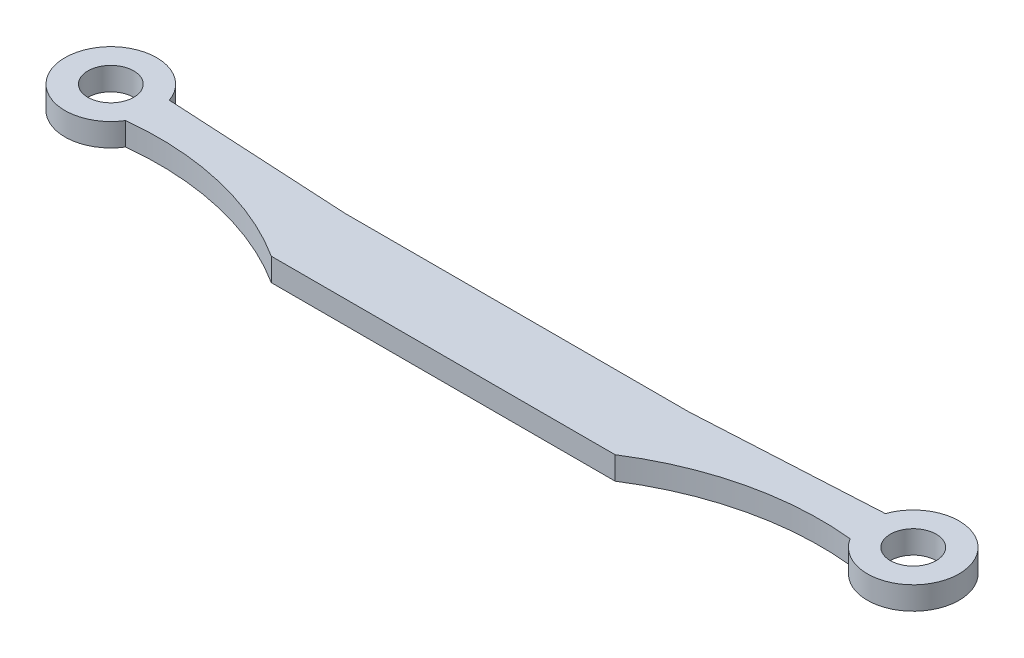
ISO-10303-21;
HEADER;
FILE_DESCRIPTION(('STEP AP214'),'2;1');
FILE_NAME('part.step','',(''),(''),'','','');
FILE_SCHEMA(('AUTOMOTIVE_DESIGN { 1 0 10303 214 1 1 1 1 }'));
ENDSEC;
DATA;
#1=APPLICATION_CONTEXT('core data for automotive mechanical design processes');
#2=APPLICATION_PROTOCOL_DEFINITION('international standard','automotive_design',2000,#1);
#3=PRODUCT_CONTEXT('',#1,'mechanical');
#4=PRODUCT('Part','Part','',(#3));
#5=PRODUCT_RELATED_PRODUCT_CATEGORY('part','',(#4));
#6=PRODUCT_DEFINITION_FORMATION('','',#4);
#7=PRODUCT_DEFINITION_CONTEXT('part definition',#1,'design');
#8=PRODUCT_DEFINITION('design','',#6,#7);
#9=PRODUCT_DEFINITION_SHAPE('','',#8);
#10=(LENGTH_UNIT() NAMED_UNIT(*) SI_UNIT(.MILLI.,.METRE.));
#11=(NAMED_UNIT(*) PLANE_ANGLE_UNIT() SI_UNIT($,.RADIAN.));
#12=(NAMED_UNIT(*) SI_UNIT($,.STERADIAN.) SOLID_ANGLE_UNIT());
#13=UNCERTAINTY_MEASURE_WITH_UNIT(LENGTH_MEASURE(1.E-05),#10,'distance_accuracy_value','');
#14=(GEOMETRIC_REPRESENTATION_CONTEXT(3) GLOBAL_UNCERTAINTY_ASSIGNED_CONTEXT((#13)) GLOBAL_UNIT_ASSIGNED_CONTEXT((#10,
#11,#12)) REPRESENTATION_CONTEXT('',''));
#15=CARTESIAN_POINT('',(0.,0.,0.));
#16=DIRECTION('',(0.,0.,1.));
#17=DIRECTION('',(1.,0.,0.));
#18=AXIS2_PLACEMENT_3D('',#15,#16,#17);
#19=CARTESIAN_POINT('',(0.,2.,10.));
#20=DIRECTION('',(0.,0.,-1.));
#21=DIRECTION('',(-1.,0.,0.));
#22=AXIS2_PLACEMENT_3D('',#19,#20,#21);
#23=PLANE('',#22);
#24=DIRECTION('',(1.,0.,0.));
#25=VECTOR('',#24,1.);
#26=CARTESIAN_POINT('',(0.,2.,10.));
#27=LINE('',#26,#25);
#28=CARTESIAN_POINT('',(-19.99,2.,10.));
#29=VERTEX_POINT('',#28);
#30=CARTESIAN_POINT('',(10.,2.,10.));
#31=VERTEX_POINT('',#30);
#32=EDGE_CURVE('E87',#29,#31,#27,.T.);
#33=ORIENTED_EDGE('',*,*,#32,.F.);
#34=DIRECTION('',(0.,-1.,0.));
#35=VECTOR('',#34,1.);
#36=CARTESIAN_POINT('',(-19.99,2.,10.));
#37=LINE('',#36,#35);
#38=CARTESIAN_POINT('',(-19.99,0.,10.));
#39=VERTEX_POINT('',#38);
#40=EDGE_CURVE('E113',#29,#39,#37,.T.);
#41=ORIENTED_EDGE('',*,*,#40,.T.);
#42=DIRECTION('',(1.,0.,0.));
#43=VECTOR('',#42,1.);
#44=CARTESIAN_POINT('',(0.,0.,10.));
#45=LINE('',#44,#43);
#46=CARTESIAN_POINT('',(10.,0.,10.));
#47=VERTEX_POINT('',#46);
#48=EDGE_CURVE('E133',#39,#47,#45,.T.);
#49=ORIENTED_EDGE('',*,*,#48,.T.);
#50=DIRECTION('',(0.,-1.,0.));
#51=VECTOR('',#50,1.);
#52=CARTESIAN_POINT('',(10.,2.,10.));
#53=LINE('',#52,#51);
#54=EDGE_CURVE('E11',#31,#47,#53,.T.);
#55=ORIENTED_EDGE('',*,*,#54,.F.);
#56=EDGE_LOOP('',(#33,#41,#49,#55));
#57=FACE_BOUND('',#56,.T.);
#58=ADVANCED_FACE('F40',(#57),#23,.F.);
#59=CARTESIAN_POINT('',(23.8689213397825,2.,31.7666757771545));
#60=DIRECTION('',(0.,-1.,0.));
#61=DIRECTION('',(0.,0.,-1.));
#62=AXIS2_PLACEMENT_3D('',#59,#60,#61);
#63=CYLINDRICAL_SURFACE('',#62,25.809594214494);
#64=CARTESIAN_POINT('',(23.8689213397825,0.,31.7666757771545));
#65=DIRECTION('',(0.,1.,0.));
#66=DIRECTION('',(0.,0.,1.));
#67=AXIS2_PLACEMENT_3D('',#64,#65,#66);
#68=CIRCLE('',#67,25.809594214494);
#69=CARTESIAN_POINT('',(26.5965924102481,0.,6.10162241566342));
#70=VERTEX_POINT('',#69);
#71=EDGE_CURVE('E136',#47,#70,#68,.F.);
#72=ORIENTED_EDGE('',*,*,#71,.T.);
#73=DIRECTION('',(0.,-1.,0.));
#74=VECTOR('',#73,1.);
#75=CARTESIAN_POINT('',(26.5965924102481,2.,6.10162241566342));
#76=LINE('',#75,#74);
#77=CARTESIAN_POINT('',(26.5965924102481,2.,6.10162241566342));
#78=VERTEX_POINT('',#77);
#79=EDGE_CURVE('E48',#78,#70,#76,.T.);
#80=ORIENTED_EDGE('',*,*,#79,.F.);
#81=CARTESIAN_POINT('',(23.8689213397825,2.,31.7666757771545));
#82=DIRECTION('',(0.,1.,0.));
#83=DIRECTION('',(0.,0.,1.));
#84=AXIS2_PLACEMENT_3D('',#81,#82,#83);
#85=CIRCLE('',#84,25.809594214494);
#86=EDGE_CURVE('E115',#31,#78,#85,.F.);
#87=ORIENTED_EDGE('',*,*,#86,.F.);
#88=ORIENTED_EDGE('',*,*,#54,.T.);
#89=EDGE_LOOP('',(#72,#80,#87,#88));
#90=FACE_BOUND('',#89,.T.);
#91=ADVANCED_FACE('F199',(#90),#63,.F.);
#92=CARTESIAN_POINT('',(30.,2.,4.));
#93=DIRECTION('',(0.,-1.,0.));
#94=DIRECTION('',(0.,0.,-1.));
#95=AXIS2_PLACEMENT_3D('',#92,#93,#94);
#96=CYLINDRICAL_SURFACE('',#95,4.);
#97=CARTESIAN_POINT('',(30.,0.,4.));
#98=DIRECTION('',(0.,1.,0.));
#99=DIRECTION('',(0.,0.,1.));
#100=AXIS2_PLACEMENT_3D('',#97,#98,#99);
#101=CIRCLE('',#100,4.);
#102=CARTESIAN_POINT('',(26.229666851978,0.,2.66411529205295));
#103=VERTEX_POINT('',#102);
#104=EDGE_CURVE('E74',#70,#103,#101,.T.);
#105=ORIENTED_EDGE('',*,*,#104,.T.);
#106=DIRECTION('',(0.,-1.,0.));
#107=VECTOR('',#106,1.);
#108=CARTESIAN_POINT('',(26.229666851978,2.,2.66411529205295));
#109=LINE('',#108,#107);
#110=CARTESIAN_POINT('',(26.229666851978,2.,2.66411529205295));
#111=VERTEX_POINT('',#110);
#112=EDGE_CURVE('E160',#111,#103,#109,.T.);
#113=ORIENTED_EDGE('',*,*,#112,.F.);
#114=CARTESIAN_POINT('',(30.,2.,4.));
#115=DIRECTION('',(0.,1.,0.));
#116=DIRECTION('',(0.,0.,1.));
#117=AXIS2_PLACEMENT_3D('',#114,#115,#116);
#118=CIRCLE('',#117,4.);
#119=EDGE_CURVE('E143',#78,#111,#118,.T.);
#120=ORIENTED_EDGE('',*,*,#119,.F.);
#121=ORIENTED_EDGE('',*,*,#79,.T.);
#122=EDGE_LOOP('',(#105,#113,#120,#121));
#123=FACE_BOUND('',#122,.T.);
#124=ADVANCED_FACE('F163',(#123),#96,.T.);
#125=CARTESIAN_POINT('',(0.22258922452665,2.,4.08219815400718));
#126=DIRECTION('',(0.0544459269489316,0.,0.998516720460239));
#127=DIRECTION('',(0.998516720460239,0.,-0.0544459269489316));
#128=AXIS2_PLACEMENT_3D('',#125,#126,#127);
#129=PLANE('',#128);
#130=DIRECTION('',(-0.998516720460239,0.,0.0544459269489316));
#131=VECTOR('',#130,1.);
#132=CARTESIAN_POINT('',(0.22258922452665,0.,4.08219815400718));
#133=LINE('',#132,#131);
#134=CARTESIAN_POINT('',(10.,0.,3.54906717890869));
#135=VERTEX_POINT('',#134);
#136=EDGE_CURVE('E80',#103,#135,#133,.T.);
#137=ORIENTED_EDGE('',*,*,#136,.T.);
#138=DIRECTION('',(0.,-1.,0.));
#139=VECTOR('',#138,1.);
#140=CARTESIAN_POINT('',(10.,2.,3.54906717890869));
#141=LINE('',#140,#139);
#142=CARTESIAN_POINT('',(10.,2.,3.54906717890869));
#143=VERTEX_POINT('',#142);
#144=EDGE_CURVE('E150',#143,#135,#141,.T.);
#145=ORIENTED_EDGE('',*,*,#144,.F.);
#146=DIRECTION('',(-0.998516720460239,0.,0.0544459269489316));
#147=VECTOR('',#146,1.);
#148=CARTESIAN_POINT('',(0.22258922452665,2.,4.08219815400718));
#149=LINE('',#148,#147);
#150=EDGE_CURVE('E56',#111,#143,#149,.T.);
#151=ORIENTED_EDGE('',*,*,#150,.F.);
#152=ORIENTED_EDGE('',*,*,#112,.T.);
#153=EDGE_LOOP('',(#137,#145,#151,#152));
#154=FACE_BOUND('',#153,.T.);
#155=ADVANCED_FACE('F200',(#154),#129,.F.);
#156=CARTESIAN_POINT('',(0.,2.,3.54906717890869));
#157=DIRECTION('',(0.,0.,1.));
#158=DIRECTION('',(1.,0.,0.));
#159=AXIS2_PLACEMENT_3D('',#156,#157,#158);
#160=PLANE('',#159);
#161=DIRECTION('',(-1.,0.,0.));
#162=VECTOR('',#161,1.);
#163=CARTESIAN_POINT('',(0.,0.,3.54906717890869));
#164=LINE('',#163,#162);
#165=CARTESIAN_POINT('',(-19.99,0.,3.5490671789087));
#166=VERTEX_POINT('',#165);
#167=EDGE_CURVE('E155',#135,#166,#164,.T.);
#168=ORIENTED_EDGE('',*,*,#167,.T.);
#169=DIRECTION('',(0.,-1.,0.));
#170=VECTOR('',#169,1.);
#171=CARTESIAN_POINT('',(-19.99,2.,3.5490671789087));
#172=LINE('',#171,#170);
#173=CARTESIAN_POINT('',(-19.99,2.,3.5490671789087));
#174=VERTEX_POINT('',#173);
#175=EDGE_CURVE('E178',#174,#166,#172,.T.);
#176=ORIENTED_EDGE('',*,*,#175,.F.);
#177=DIRECTION('',(-1.,0.,0.));
#178=VECTOR('',#177,1.);
#179=CARTESIAN_POINT('',(0.,2.,3.54906717890869));
#180=LINE('',#179,#178);
#181=EDGE_CURVE('E146',#143,#174,#180,.T.);
#182=ORIENTED_EDGE('',*,*,#181,.F.);
#183=ORIENTED_EDGE('',*,*,#144,.T.);
#184=EDGE_LOOP('',(#168,#176,#182,#183));
#185=FACE_BOUND('',#184,.T.);
#186=ADVANCED_FACE('F176',(#185),#160,.F.);
#187=CARTESIAN_POINT('',(30.,2.,4.));
#188=DIRECTION('',(0.,-1.,0.));
#189=DIRECTION('',(0.,0.,-1.));
#190=AXIS2_PLACEMENT_3D('',#187,#188,#189);
#191=CYLINDRICAL_SURFACE('',#190,2.);
#192=CARTESIAN_POINT('',(30.,2.,4.));
#193=DIRECTION('',(0.,1.,0.));
#194=DIRECTION('',(0.,0.,1.));
#195=AXIS2_PLACEMENT_3D('',#192,#193,#194);
#196=CIRCLE('',#195,2.);
#197=CARTESIAN_POINT('',(30.,2.,6.));
#198=VERTEX_POINT('',#197);
#199=EDGE_CURVE('E148',#198,#198,#196,.T.);
#200=ORIENTED_EDGE('',*,*,#199,.T.);
#201=EDGE_LOOP('',(#200));
#202=FACE_BOUND('',#201,.T.);
#203=CARTESIAN_POINT('',(30.,0.,4.));
#204=DIRECTION('',(0.,1.,0.));
#205=DIRECTION('',(0.,0.,1.));
#206=AXIS2_PLACEMENT_3D('',#203,#204,#205);
#207=CIRCLE('',#206,2.);
#208=CARTESIAN_POINT('',(30.,0.,6.));
#209=VERTEX_POINT('',#208);
#210=EDGE_CURVE('E116',#209,#209,#207,.T.);
#211=ORIENTED_EDGE('',*,*,#210,.F.);
#212=EDGE_LOOP('',(#211));
#213=FACE_BOUND('',#212,.T.);
#214=ADVANCED_FACE('F207',(#202,#213),#191,.F.);
#215=CARTESIAN_POINT('',(0.,2.,0.));
#216=DIRECTION('',(0.,1.,0.));
#217=DIRECTION('',(0.,0.,1.));
#218=AXIS2_PLACEMENT_3D('',#215,#216,#217);
#219=PLANE('',#218);
#220=ORIENTED_EDGE('',*,*,#181,.T.);
#221=DIRECTION('',(0.998516720460239,0.,0.0544459269489311));
#222=VECTOR('',#221,1.);
#223=CARTESIAN_POINT('',(-10.2125892245267,2.,4.08219815400719));
#224=LINE('',#223,#222);
#225=CARTESIAN_POINT('',(-36.219666851978,2.,2.66411529205297));
#226=VERTEX_POINT('',#225);
#227=EDGE_CURVE('E184',#226,#174,#224,.T.);
#228=ORIENTED_EDGE('',*,*,#227,.F.);
#229=CARTESIAN_POINT('',(-39.99,2.,4.00000000000002));
#230=DIRECTION('',(0.,-1.,0.));
#231=DIRECTION('',(0.,0.,1.));
#232=AXIS2_PLACEMENT_3D('',#229,#230,#231);
#233=CIRCLE('',#232,4.);
#234=CARTESIAN_POINT('',(-36.5865924102481,2.,6.10162241566343));
#235=VERTEX_POINT('',#234);
#236=EDGE_CURVE('E123',#235,#226,#233,.T.);
#237=ORIENTED_EDGE('',*,*,#236,.F.);
#238=CARTESIAN_POINT('',(-33.8589213397825,2.,31.7666757771545));
#239=DIRECTION('',(0.,-1.,0.));
#240=DIRECTION('',(0.,0.,1.));
#241=AXIS2_PLACEMENT_3D('',#238,#239,#240);
#242=CIRCLE('',#241,25.809594214494);
#243=EDGE_CURVE('E119',#29,#235,#242,.F.);
#244=ORIENTED_EDGE('',*,*,#243,.F.);
#245=ORIENTED_EDGE('',*,*,#32,.T.);
#246=ORIENTED_EDGE('',*,*,#86,.T.);
#247=ORIENTED_EDGE('',*,*,#119,.T.);
#248=ORIENTED_EDGE('',*,*,#150,.T.);
#249=EDGE_LOOP('',(#220,#228,#237,#244,#245,#246,#247,#248));
#250=FACE_BOUND('',#249,.T.);
#251=ORIENTED_EDGE('',*,*,#199,.F.);
#252=EDGE_LOOP('',(#251));
#253=FACE_BOUND('',#252,.T.);
#254=CARTESIAN_POINT('',(-39.99,2.,4.00000000000002));
#255=DIRECTION('',(0.,-1.,0.));
#256=DIRECTION('',(0.,0.,1.));
#257=AXIS2_PLACEMENT_3D('',#254,#255,#256);
#258=CIRCLE('',#257,2.);
#259=CARTESIAN_POINT('',(-39.99,2.,6.00000000000002));
#260=VERTEX_POINT('',#259);
#261=EDGE_CURVE('E185',#260,#260,#258,.T.);
#262=ORIENTED_EDGE('',*,*,#261,.T.);
#263=EDGE_LOOP('',(#262));
#264=FACE_BOUND('',#263,.T.);
#265=ADVANCED_FACE('F120',(#250,#253,#264),#219,.T.);
#266=CARTESIAN_POINT('',(0.,0.,0.));
#267=DIRECTION('',(0.,1.,0.));
#268=DIRECTION('',(0.,0.,1.));
#269=AXIS2_PLACEMENT_3D('',#266,#267,#268);
#270=PLANE('',#269);
#271=ORIENTED_EDGE('',*,*,#48,.F.);
#272=CARTESIAN_POINT('',(-33.8589213397825,0.,31.7666757771545));
#273=DIRECTION('',(0.,-1.,0.));
#274=DIRECTION('',(0.,0.,1.));
#275=AXIS2_PLACEMENT_3D('',#272,#273,#274);
#276=CIRCLE('',#275,25.809594214494);
#277=CARTESIAN_POINT('',(-36.5865924102481,0.,6.10162241566343));
#278=VERTEX_POINT('',#277);
#279=EDGE_CURVE('E132',#39,#278,#276,.F.);
#280=ORIENTED_EDGE('',*,*,#279,.T.);
#281=CARTESIAN_POINT('',(-39.99,0.,4.00000000000002));
#282=DIRECTION('',(0.,-1.,0.));
#283=DIRECTION('',(0.,0.,1.));
#284=AXIS2_PLACEMENT_3D('',#281,#282,#283);
#285=CIRCLE('',#284,4.);
#286=CARTESIAN_POINT('',(-36.219666851978,0.,2.66411529205297));
#287=VERTEX_POINT('',#286);
#288=EDGE_CURVE('E193',#278,#287,#285,.T.);
#289=ORIENTED_EDGE('',*,*,#288,.T.);
#290=DIRECTION('',(0.998516720460239,0.,0.0544459269489311));
#291=VECTOR('',#290,1.);
#292=CARTESIAN_POINT('',(-10.2125892245267,0.,4.08219815400719));
#293=LINE('',#292,#291);
#294=EDGE_CURVE('E172',#287,#166,#293,.T.);
#295=ORIENTED_EDGE('',*,*,#294,.T.);
#296=ORIENTED_EDGE('',*,*,#167,.F.);
#297=ORIENTED_EDGE('',*,*,#136,.F.);
#298=ORIENTED_EDGE('',*,*,#104,.F.);
#299=ORIENTED_EDGE('',*,*,#71,.F.);
#300=EDGE_LOOP('',(#271,#280,#289,#295,#296,#297,#298,#299));
#301=FACE_BOUND('',#300,.T.);
#302=ORIENTED_EDGE('',*,*,#210,.T.);
#303=EDGE_LOOP('',(#302));
#304=FACE_BOUND('',#303,.T.);
#305=CARTESIAN_POINT('',(-39.99,0.,4.00000000000002));
#306=DIRECTION('',(0.,-1.,0.));
#307=DIRECTION('',(0.,0.,1.));
#308=AXIS2_PLACEMENT_3D('',#305,#306,#307);
#309=CIRCLE('',#308,2.);
#310=CARTESIAN_POINT('',(-39.99,0.,6.00000000000002));
#311=VERTEX_POINT('',#310);
#312=EDGE_CURVE('E127',#311,#311,#309,.T.);
#313=ORIENTED_EDGE('',*,*,#312,.F.);
#314=EDGE_LOOP('',(#313));
#315=FACE_BOUND('',#314,.T.);
#316=ADVANCED_FACE('F167',(#301,#304,#315),#270,.F.);
#317=CARTESIAN_POINT('',(-33.8589213397825,2.,31.7666757771545));
#318=DIRECTION('',(0.,-1.,0.));
#319=DIRECTION('',(0.,0.,-1.));
#320=AXIS2_PLACEMENT_3D('',#317,#318,#319);
#321=CYLINDRICAL_SURFACE('',#320,25.809594214494);
#322=ORIENTED_EDGE('',*,*,#279,.F.);
#323=ORIENTED_EDGE('',*,*,#40,.F.);
#324=ORIENTED_EDGE('',*,*,#243,.T.);
#325=DIRECTION('',(0.,-1.,0.));
#326=VECTOR('',#325,1.);
#327=CARTESIAN_POINT('',(-36.5865924102481,2.,6.10162241566343));
#328=LINE('',#327,#326);
#329=EDGE_CURVE('E134',#235,#278,#328,.T.);
#330=ORIENTED_EDGE('',*,*,#329,.T.);
#331=EDGE_LOOP('',(#322,#323,#324,#330));
#332=FACE_BOUND('',#331,.T.);
#333=ADVANCED_FACE('F130',(#332),#321,.F.);
#334=CARTESIAN_POINT('',(-39.99,2.,4.00000000000002));
#335=DIRECTION('',(0.,-1.,0.));
#336=DIRECTION('',(0.,0.,-1.));
#337=AXIS2_PLACEMENT_3D('',#334,#335,#336);
#338=CYLINDRICAL_SURFACE('',#337,4.);
#339=ORIENTED_EDGE('',*,*,#288,.F.);
#340=ORIENTED_EDGE('',*,*,#329,.F.);
#341=ORIENTED_EDGE('',*,*,#236,.T.);
#342=DIRECTION('',(0.,-1.,0.));
#343=VECTOR('',#342,1.);
#344=CARTESIAN_POINT('',(-36.219666851978,2.,2.66411529205297));
#345=LINE('',#344,#343);
#346=EDGE_CURVE('E138',#226,#287,#345,.T.);
#347=ORIENTED_EDGE('',*,*,#346,.T.);
#348=EDGE_LOOP('',(#339,#340,#341,#347));
#349=FACE_BOUND('',#348,.T.);
#350=ADVANCED_FACE('F198',(#349),#338,.T.);
#351=CARTESIAN_POINT('',(-10.2125892245267,2.,4.08219815400719));
#352=DIRECTION('',(-0.0544459269489311,0.,0.998516720460239));
#353=DIRECTION('',(-0.998516720460239,0.,-0.0544459269489311));
#354=AXIS2_PLACEMENT_3D('',#351,#352,#353);
#355=PLANE('',#354);
#356=ORIENTED_EDGE('',*,*,#294,.F.);
#357=ORIENTED_EDGE('',*,*,#346,.F.);
#358=ORIENTED_EDGE('',*,*,#227,.T.);
#359=ORIENTED_EDGE('',*,*,#175,.T.);
#360=EDGE_LOOP('',(#356,#357,#358,#359));
#361=FACE_BOUND('',#360,.T.);
#362=ADVANCED_FACE('F181',(#361),#355,.F.);
#363=CARTESIAN_POINT('',(-39.99,2.,4.00000000000002));
#364=DIRECTION('',(0.,-1.,0.));
#365=DIRECTION('',(0.,0.,-1.));
#366=AXIS2_PLACEMENT_3D('',#363,#364,#365);
#367=CYLINDRICAL_SURFACE('',#366,2.);
#368=ORIENTED_EDGE('',*,*,#261,.F.);
#369=EDGE_LOOP('',(#368));
#370=FACE_BOUND('',#369,.T.);
#371=ORIENTED_EDGE('',*,*,#312,.T.);
#372=EDGE_LOOP('',(#371));
#373=FACE_BOUND('',#372,.T.);
#374=ADVANCED_FACE('F297',(#370,#373),#367,.F.);
#375=CLOSED_SHELL('',(#58,#91,#124,#155,#186,#214,#265,#316,#333,#350,#362,#374));
#376=MANIFOLD_SOLID_BREP('B2',#375);
#377=ADVANCED_BREP_SHAPE_REPRESENTATION('',(#18,#376),#14);
#378=SHAPE_DEFINITION_REPRESENTATION(#9,#377);
ENDSEC;
END-ISO-10303-21;
